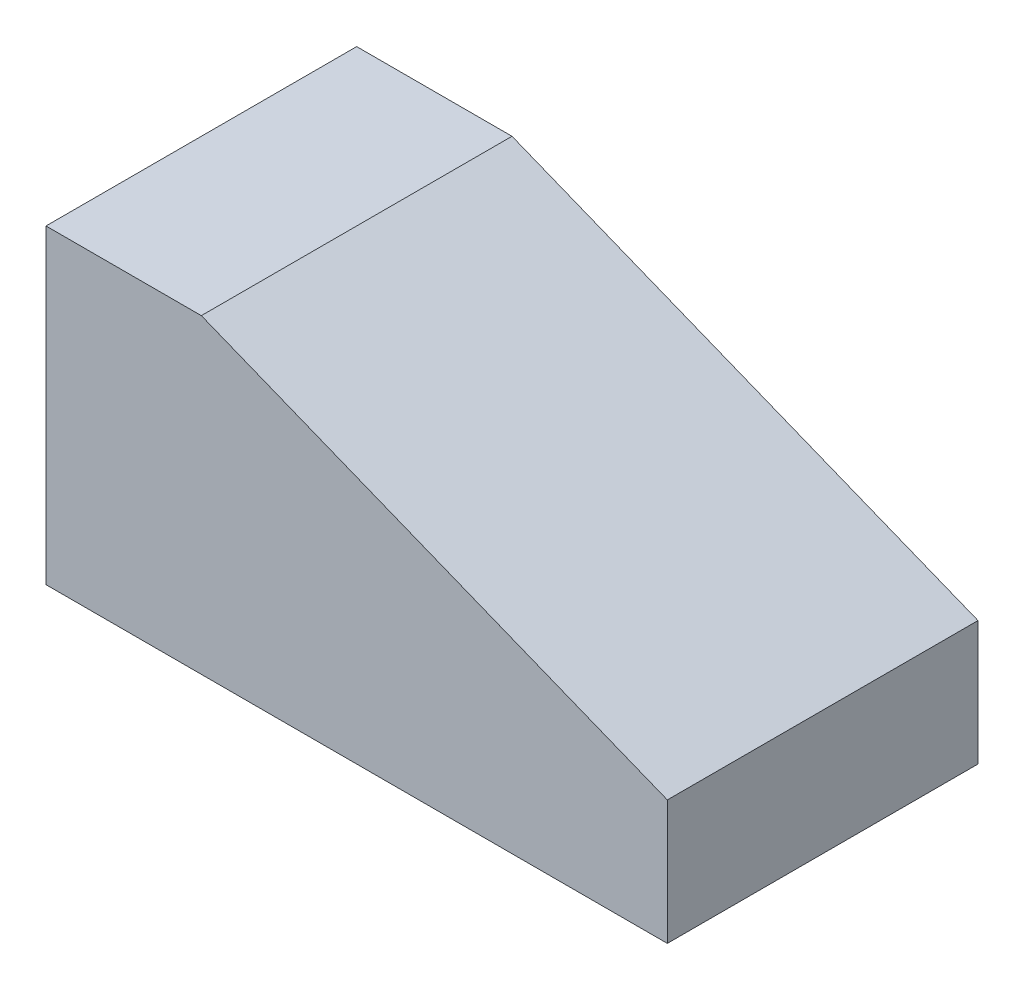
ISO-10303-21;
HEADER;
FILE_DESCRIPTION(('STEP AP214'),'2;1');
FILE_NAME('part.step','',(''),(''),'','','');
FILE_SCHEMA(('AUTOMOTIVE_DESIGN { 1 0 10303 214 1 1 1 1 }'));
ENDSEC;
DATA;
#1=APPLICATION_CONTEXT('core data for automotive mechanical design processes');
#2=APPLICATION_PROTOCOL_DEFINITION('international standard','automotive_design',2000,#1);
#3=PRODUCT_CONTEXT('',#1,'mechanical');
#4=PRODUCT('Part','Part','',(#3));
#5=PRODUCT_RELATED_PRODUCT_CATEGORY('part','',(#4));
#6=PRODUCT_DEFINITION_FORMATION('','',#4);
#7=PRODUCT_DEFINITION_CONTEXT('part definition',#1,'design');
#8=PRODUCT_DEFINITION('design','',#6,#7);
#9=PRODUCT_DEFINITION_SHAPE('','',#8);
#10=(LENGTH_UNIT() NAMED_UNIT(*) SI_UNIT(.MILLI.,.METRE.));
#11=(NAMED_UNIT(*) PLANE_ANGLE_UNIT() SI_UNIT($,.RADIAN.));
#12=(NAMED_UNIT(*) SI_UNIT($,.STERADIAN.) SOLID_ANGLE_UNIT());
#13=UNCERTAINTY_MEASURE_WITH_UNIT(LENGTH_MEASURE(1.E-05),#10,'distance_accuracy_value','');
#14=(GEOMETRIC_REPRESENTATION_CONTEXT(3) GLOBAL_UNCERTAINTY_ASSIGNED_CONTEXT((#13)) GLOBAL_UNIT_ASSIGNED_CONTEXT((#10,
#11,#12)) REPRESENTATION_CONTEXT('',''));
#15=CARTESIAN_POINT('',(0.,0.,0.));
#16=DIRECTION('',(0.,0.,1.));
#17=DIRECTION('',(1.,0.,0.));
#18=AXIS2_PLACEMENT_3D('',#15,#16,#17);
#19=CARTESIAN_POINT('',(0.,50.,50.));
#20=DIRECTION('',(1.,0.,0.));
#21=DIRECTION('',(0.,0.,-1.));
#22=AXIS2_PLACEMENT_3D('',#19,#20,#21);
#23=PLANE('',#22);
#24=DIRECTION('',(0.,-1.,0.));
#25=VECTOR('',#24,1.);
#26=CARTESIAN_POINT('',(0.,50.,0.));
#27=LINE('',#26,#25);
#28=CARTESIAN_POINT('',(0.,50.,0.));
#29=VERTEX_POINT('',#28);
#30=CARTESIAN_POINT('',(0.,0.,0.));
#31=VERTEX_POINT('',#30);
#32=EDGE_CURVE('E124',#29,#31,#27,.T.);
#33=ORIENTED_EDGE('',*,*,#32,.T.);
#34=DIRECTION('',(0.,0.,-1.));
#35=VECTOR('',#34,1.);
#36=CARTESIAN_POINT('',(0.,0.,50.));
#37=LINE('',#36,#35);
#38=CARTESIAN_POINT('',(0.,0.,50.));
#39=VERTEX_POINT('',#38);
#40=EDGE_CURVE('E11',#39,#31,#37,.T.);
#41=ORIENTED_EDGE('',*,*,#40,.F.);
#42=DIRECTION('',(0.,-1.,0.));
#43=VECTOR('',#42,1.);
#44=CARTESIAN_POINT('',(0.,50.,50.));
#45=LINE('',#44,#43);
#46=CARTESIAN_POINT('',(0.,50.,50.));
#47=VERTEX_POINT('',#46);
#48=EDGE_CURVE('E137',#47,#39,#45,.T.);
#49=ORIENTED_EDGE('',*,*,#48,.F.);
#50=DIRECTION('',(0.,0.,-1.));
#51=VECTOR('',#50,1.);
#52=CARTESIAN_POINT('',(0.,50.,50.));
#53=LINE('',#52,#51);
#54=EDGE_CURVE('E120',#47,#29,#53,.T.);
#55=ORIENTED_EDGE('',*,*,#54,.T.);
#56=EDGE_LOOP('',(#33,#41,#49,#55));
#57=FACE_BOUND('',#56,.T.);
#58=ADVANCED_FACE('F45',(#57),#23,.F.);
#59=CARTESIAN_POINT('',(0.,0.,50.));
#60=DIRECTION('',(0.,1.,0.));
#61=DIRECTION('',(0.,0.,1.));
#62=AXIS2_PLACEMENT_3D('',#59,#60,#61);
#63=PLANE('',#62);
#64=DIRECTION('',(1.,0.,0.));
#65=VECTOR('',#64,1.);
#66=CARTESIAN_POINT('',(0.,0.,0.));
#67=LINE('',#66,#65);
#68=CARTESIAN_POINT('',(100.,0.,0.));
#69=VERTEX_POINT('',#68);
#70=EDGE_CURVE('E128',#31,#69,#67,.T.);
#71=ORIENTED_EDGE('',*,*,#70,.T.);
#72=DIRECTION('',(0.,0.,-1.));
#73=VECTOR('',#72,1.);
#74=CARTESIAN_POINT('',(100.,0.,50.));
#75=LINE('',#74,#73);
#76=CARTESIAN_POINT('',(100.,0.,50.));
#77=VERTEX_POINT('',#76);
#78=EDGE_CURVE('E54',#77,#69,#75,.T.);
#79=ORIENTED_EDGE('',*,*,#78,.F.);
#80=DIRECTION('',(1.,0.,0.));
#81=VECTOR('',#80,1.);
#82=CARTESIAN_POINT('',(0.,0.,50.));
#83=LINE('',#82,#81);
#84=EDGE_CURVE('E96',#39,#77,#83,.T.);
#85=ORIENTED_EDGE('',*,*,#84,.F.);
#86=ORIENTED_EDGE('',*,*,#40,.T.);
#87=EDGE_LOOP('',(#71,#79,#85,#86));
#88=FACE_BOUND('',#87,.T.);
#89=ADVANCED_FACE('F159',(#88),#63,.F.);
#90=CARTESIAN_POINT('',(100.,0.,50.));
#91=DIRECTION('',(-1.,0.,0.));
#92=DIRECTION('',(0.,0.,1.));
#93=AXIS2_PLACEMENT_3D('',#90,#91,#92);
#94=PLANE('',#93);
#95=DIRECTION('',(0.,1.,0.));
#96=VECTOR('',#95,1.);
#97=CARTESIAN_POINT('',(100.,0.,0.));
#98=LINE('',#97,#96);
#99=CARTESIAN_POINT('',(100.,20.,0.));
#100=VERTEX_POINT('',#99);
#101=EDGE_CURVE('E112',#69,#100,#98,.T.);
#102=ORIENTED_EDGE('',*,*,#101,.T.);
#103=DIRECTION('',(0.,0.,-1.));
#104=VECTOR('',#103,1.);
#105=CARTESIAN_POINT('',(100.,20.,50.));
#106=LINE('',#105,#104);
#107=CARTESIAN_POINT('',(100.,20.,50.));
#108=VERTEX_POINT('',#107);
#109=EDGE_CURVE('E109',#108,#100,#106,.T.);
#110=ORIENTED_EDGE('',*,*,#109,.F.);
#111=DIRECTION('',(0.,1.,0.));
#112=VECTOR('',#111,1.);
#113=CARTESIAN_POINT('',(100.,0.,50.));
#114=LINE('',#113,#112);
#115=EDGE_CURVE('E100',#77,#108,#114,.T.);
#116=ORIENTED_EDGE('',*,*,#115,.F.);
#117=ORIENTED_EDGE('',*,*,#78,.T.);
#118=EDGE_LOOP('',(#102,#110,#116,#117));
#119=FACE_BOUND('',#118,.T.);
#120=ADVANCED_FACE('F110',(#119),#94,.F.);
#121=CARTESIAN_POINT('',(100.,20.,50.));
#122=DIRECTION('',(-0.371390676354104,-0.928476690885259,0.));
#123=DIRECTION('',(0.928476690885259,-0.371390676354104,0.));
#124=AXIS2_PLACEMENT_3D('',#121,#122,#123);
#125=PLANE('',#124);
#126=DIRECTION('',(-0.928476690885259,0.371390676354104,0.));
#127=VECTOR('',#126,1.);
#128=CARTESIAN_POINT('',(100.,20.,0.));
#129=LINE('',#128,#127);
#130=CARTESIAN_POINT('',(25.,50.,0.));
#131=VERTEX_POINT('',#130);
#132=EDGE_CURVE('E82',#100,#131,#129,.T.);
#133=ORIENTED_EDGE('',*,*,#132,.T.);
#134=DIRECTION('',(0.,0.,-1.));
#135=VECTOR('',#134,1.);
#136=CARTESIAN_POINT('',(25.,50.,50.));
#137=LINE('',#136,#135);
#138=CARTESIAN_POINT('',(25.,50.,50.));
#139=VERTEX_POINT('',#138);
#140=EDGE_CURVE('E114',#139,#131,#137,.T.);
#141=ORIENTED_EDGE('',*,*,#140,.F.);
#142=DIRECTION('',(-0.928476690885259,0.371390676354104,0.));
#143=VECTOR('',#142,1.);
#144=CARTESIAN_POINT('',(100.,20.,50.));
#145=LINE('',#144,#143);
#146=EDGE_CURVE('E104',#108,#139,#145,.T.);
#147=ORIENTED_EDGE('',*,*,#146,.F.);
#148=ORIENTED_EDGE('',*,*,#109,.T.);
#149=EDGE_LOOP('',(#133,#141,#147,#148));
#150=FACE_BOUND('',#149,.T.);
#151=ADVANCED_FACE('F116',(#150),#125,.F.);
#152=CARTESIAN_POINT('',(25.,50.,50.));
#153=DIRECTION('',(0.,-1.,0.));
#154=DIRECTION('',(1.,0.,0.));
#155=AXIS2_PLACEMENT_3D('',#152,#153,#154);
#156=PLANE('',#155);
#157=DIRECTION('',(-1.,0.,0.));
#158=VECTOR('',#157,1.);
#159=CARTESIAN_POINT('',(25.,50.,0.));
#160=LINE('',#159,#158);
#161=EDGE_CURVE('E88',#131,#29,#160,.T.);
#162=ORIENTED_EDGE('',*,*,#161,.T.);
#163=ORIENTED_EDGE('',*,*,#54,.F.);
#164=DIRECTION('',(-1.,0.,0.));
#165=VECTOR('',#164,1.);
#166=CARTESIAN_POINT('',(25.,50.,50.));
#167=LINE('',#166,#165);
#168=EDGE_CURVE('E62',#139,#47,#167,.T.);
#169=ORIENTED_EDGE('',*,*,#168,.F.);
#170=ORIENTED_EDGE('',*,*,#140,.T.);
#171=EDGE_LOOP('',(#162,#163,#169,#170));
#172=FACE_BOUND('',#171,.T.);
#173=ADVANCED_FACE('F148',(#172),#156,.F.);
#174=CARTESIAN_POINT('',(0.,0.,50.));
#175=DIRECTION('',(0.,0.,1.));
#176=DIRECTION('',(1.,0.,0.));
#177=AXIS2_PLACEMENT_3D('',#174,#175,#176);
#178=PLANE('',#177);
#179=ORIENTED_EDGE('',*,*,#48,.T.);
#180=ORIENTED_EDGE('',*,*,#84,.T.);
#181=ORIENTED_EDGE('',*,*,#115,.T.);
#182=ORIENTED_EDGE('',*,*,#146,.T.);
#183=ORIENTED_EDGE('',*,*,#168,.T.);
#184=EDGE_LOOP('',(#179,#180,#181,#182,#183));
#185=FACE_BOUND('',#184,.T.);
#186=ADVANCED_FACE('F102',(#185),#178,.T.);
#187=CARTESIAN_POINT('',(0.,0.,0.));
#188=DIRECTION('',(0.,0.,1.));
#189=DIRECTION('',(1.,0.,0.));
#190=AXIS2_PLACEMENT_3D('',#187,#188,#189);
#191=PLANE('',#190);
#192=ORIENTED_EDGE('',*,*,#32,.F.);
#193=ORIENTED_EDGE('',*,*,#161,.F.);
#194=ORIENTED_EDGE('',*,*,#132,.F.);
#195=ORIENTED_EDGE('',*,*,#101,.F.);
#196=ORIENTED_EDGE('',*,*,#70,.F.);
#197=EDGE_LOOP('',(#192,#193,#194,#195,#196));
#198=FACE_BOUND('',#197,.T.);
#199=ADVANCED_FACE('F144',(#198),#191,.F.);
#200=CLOSED_SHELL('',(#58,#89,#120,#151,#173,#186,#199));
#201=MANIFOLD_SOLID_BREP('B2',#200);
#202=ADVANCED_BREP_SHAPE_REPRESENTATION('',(#18,#201),#14);
#203=SHAPE_DEFINITION_REPRESENTATION(#9,#202);
ENDSEC;
END-ISO-10303-21;
